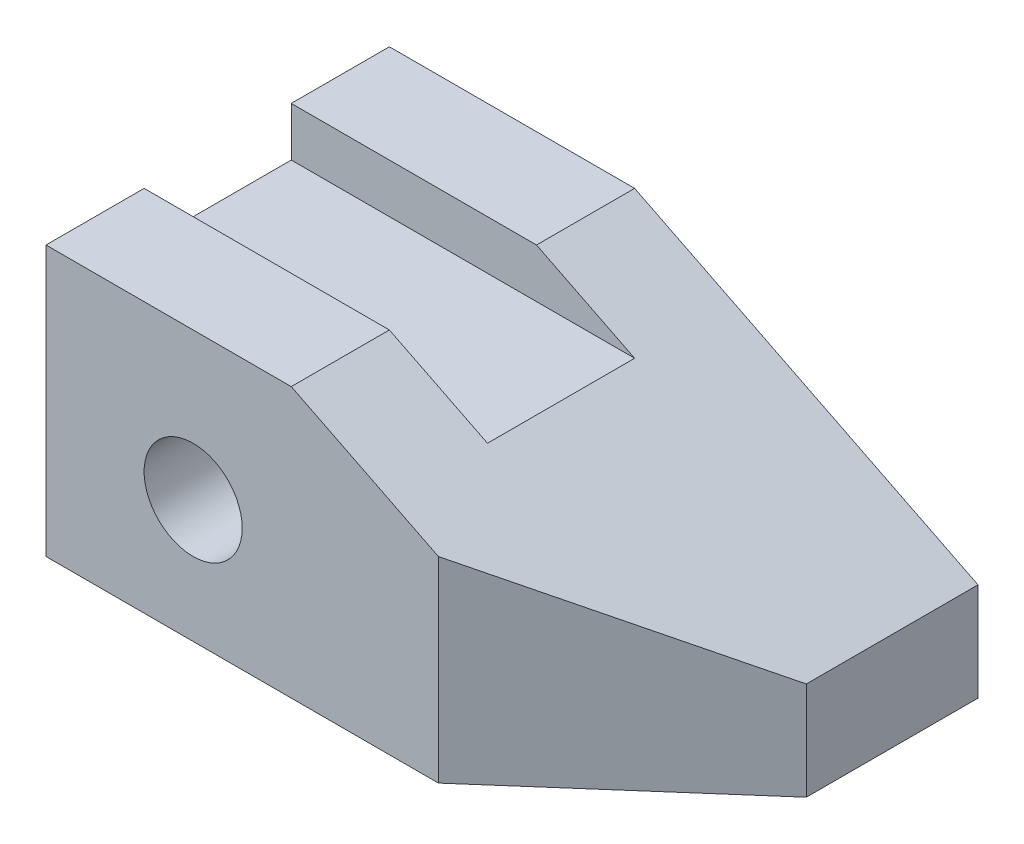
ISO-10303-21;
HEADER;
FILE_DESCRIPTION(('STEP AP214'),'2;1');
FILE_NAME('part.step','',(''),(''),'','','');
FILE_SCHEMA(('AUTOMOTIVE_DESIGN { 1 0 10303 214 1 1 1 1 }'));
ENDSEC;
DATA;
#1=APPLICATION_CONTEXT('core data for automotive mechanical design processes');
#2=APPLICATION_PROTOCOL_DEFINITION('international standard','automotive_design',2000,#1);
#3=PRODUCT_CONTEXT('',#1,'mechanical');
#4=PRODUCT('Part','Part','',(#3));
#5=PRODUCT_RELATED_PRODUCT_CATEGORY('part','',(#4));
#6=PRODUCT_DEFINITION_FORMATION('','',#4);
#7=PRODUCT_DEFINITION_CONTEXT('part definition',#1,'design');
#8=PRODUCT_DEFINITION('design','',#6,#7);
#9=PRODUCT_DEFINITION_SHAPE('','',#8);
#10=(LENGTH_UNIT() NAMED_UNIT(*) SI_UNIT(.MILLI.,.METRE.));
#11=(NAMED_UNIT(*) PLANE_ANGLE_UNIT() SI_UNIT($,.RADIAN.));
#12=(NAMED_UNIT(*) SI_UNIT($,.STERADIAN.) SOLID_ANGLE_UNIT());
#13=UNCERTAINTY_MEASURE_WITH_UNIT(LENGTH_MEASURE(1.E-05),#10,'distance_accuracy_value','');
#14=(GEOMETRIC_REPRESENTATION_CONTEXT(3) GLOBAL_UNCERTAINTY_ASSIGNED_CONTEXT((#13)) GLOBAL_UNIT_ASSIGNED_CONTEXT((#10,
#11,#12)) REPRESENTATION_CONTEXT('',''));
#15=CARTESIAN_POINT('',(0.,0.,0.));
#16=DIRECTION('',(0.,0.,1.));
#17=DIRECTION('',(1.,0.,0.));
#18=AXIS2_PLACEMENT_3D('',#15,#16,#17);
#19=CARTESIAN_POINT('',(0.,69.85,0.));
#20=DIRECTION('',(0.,-1.,0.));
#21=DIRECTION('',(0.,0.,-1.));
#22=AXIS2_PLACEMENT_3D('',#19,#20,#21);
#23=PLANE('',#22);
#24=DIRECTION('',(0.,0.,1.));
#25=VECTOR('',#24,1.);
#26=CARTESIAN_POINT('',(0.,69.85,0.));
#27=LINE('',#26,#25);
#28=CARTESIAN_POINT('',(0.,69.85,-88.9));
#29=VERTEX_POINT('',#28);
#30=CARTESIAN_POINT('',(0.,69.85,-63.5));
#31=VERTEX_POINT('',#30);
#32=EDGE_CURVE('E164',#29,#31,#27,.T.);
#33=ORIENTED_EDGE('',*,*,#32,.T.);
#34=DIRECTION('',(-1.,0.,0.));
#35=VECTOR('',#34,1.);
#36=CARTESIAN_POINT('',(152.4,69.85,-63.5));
#37=LINE('',#36,#35);
#38=CARTESIAN_POINT('',(63.5,69.85,-63.5));
#39=VERTEX_POINT('',#38);
#40=EDGE_CURVE('E123',#39,#31,#37,.T.);
#41=ORIENTED_EDGE('',*,*,#40,.F.);
#42=DIRECTION('',(0.,0.,1.));
#43=VECTOR('',#42,1.);
#44=CARTESIAN_POINT('',(63.5,69.85,-88.9));
#45=LINE('',#44,#43);
#46=CARTESIAN_POINT('',(63.4999999999999,69.85,-88.9));
#47=VERTEX_POINT('',#46);
#48=EDGE_CURVE('E157',#47,#39,#45,.T.);
#49=ORIENTED_EDGE('',*,*,#48,.F.);
#50=DIRECTION('',(-1.,0.,0.));
#51=VECTOR('',#50,1.);
#52=CARTESIAN_POINT('',(0.,69.85,-88.9));
#53=LINE('',#52,#51);
#54=EDGE_CURVE('E170',#47,#29,#53,.T.);
#55=ORIENTED_EDGE('',*,*,#54,.T.);
#56=EDGE_LOOP('',(#33,#41,#49,#55));
#57=FACE_BOUND('',#56,.T.);
#58=ADVANCED_FACE('F33',(#57),#23,.F.);
#59=CARTESIAN_POINT('',(0.,69.85,0.));
#60=DIRECTION('',(1.,0.,0.));
#61=DIRECTION('',(0.,0.,-1.));
#62=AXIS2_PLACEMENT_3D('',#59,#60,#61);
#63=PLANE('',#62);
#64=DIRECTION('',(0.,0.,1.));
#65=VECTOR('',#64,1.);
#66=CARTESIAN_POINT('',(0.,57.15,-63.5));
#67=LINE('',#66,#65);
#68=CARTESIAN_POINT('',(0.,57.15,-63.5));
#69=VERTEX_POINT('',#68);
#70=CARTESIAN_POINT('',(0.,57.15,-25.4));
#71=VERTEX_POINT('',#70);
#72=EDGE_CURVE('E112',#69,#71,#67,.T.);
#73=ORIENTED_EDGE('',*,*,#72,.F.);
#74=DIRECTION('',(0.,-1.,0.));
#75=VECTOR('',#74,1.);
#76=CARTESIAN_POINT('',(0.,69.85,-63.5));
#77=LINE('',#76,#75);
#78=EDGE_CURVE('E120',#31,#69,#77,.T.);
#79=ORIENTED_EDGE('',*,*,#78,.F.);
#80=ORIENTED_EDGE('',*,*,#32,.F.);
#81=DIRECTION('',(0.,-1.,0.));
#82=VECTOR('',#81,1.);
#83=CARTESIAN_POINT('',(0.,69.85,-88.9));
#84=LINE('',#83,#82);
#85=CARTESIAN_POINT('',(0.,0.,-88.9));
#86=VERTEX_POINT('',#85);
#87=EDGE_CURVE('E172',#29,#86,#84,.T.);
#88=ORIENTED_EDGE('',*,*,#87,.T.);
#89=DIRECTION('',(0.,0.,1.));
#90=VECTOR('',#89,1.);
#91=CARTESIAN_POINT('',(0.,0.,0.));
#92=LINE('',#91,#90);
#93=CARTESIAN_POINT('',(0.,0.,0.));
#94=VERTEX_POINT('',#93);
#95=EDGE_CURVE('E156',#86,#94,#92,.T.);
#96=ORIENTED_EDGE('',*,*,#95,.T.);
#97=DIRECTION('',(0.,-1.,0.));
#98=VECTOR('',#97,1.);
#99=CARTESIAN_POINT('',(0.,69.85,0.));
#100=LINE('',#99,#98);
#101=CARTESIAN_POINT('',(0.,69.85,0.));
#102=VERTEX_POINT('',#101);
#103=EDGE_CURVE('E187',#102,#94,#100,.T.);
#104=ORIENTED_EDGE('',*,*,#103,.F.);
#105=CARTESIAN_POINT('',(0.,69.85,-25.4));
#106=VERTEX_POINT('',#105);
#107=EDGE_CURVE('E167',#106,#102,#27,.T.);
#108=ORIENTED_EDGE('',*,*,#107,.F.);
#109=DIRECTION('',(0.,1.,0.));
#110=VECTOR('',#109,1.);
#111=CARTESIAN_POINT('',(0.,69.85,-25.4));
#112=LINE('',#111,#110);
#113=EDGE_CURVE('E117',#71,#106,#112,.T.);
#114=ORIENTED_EDGE('',*,*,#113,.F.);
#115=EDGE_LOOP('',(#73,#79,#80,#88,#96,#104,#108,#114));
#116=FACE_BOUND('',#115,.T.);
#117=ADVANCED_FACE('F35',(#116),#63,.F.);
#118=CARTESIAN_POINT('',(0.,69.85,0.));
#119=DIRECTION('',(0.,0.,-1.));
#120=DIRECTION('',(-1.,0.,0.));
#121=AXIS2_PLACEMENT_3D('',#118,#119,#120);
#122=PLANE('',#121);
#123=CARTESIAN_POINT('',(38.1,31.75,0.));
#124=DIRECTION('',(0.,0.,1.));
#125=DIRECTION('',(1.,0.,0.));
#126=AXIS2_PLACEMENT_3D('',#123,#124,#125);
#127=CIRCLE('',#126,12.7);
#128=CARTESIAN_POINT('',(50.8,31.75,0.));
#129=VERTEX_POINT('',#128);
#130=EDGE_CURVE('E143',#129,#129,#127,.T.);
#131=ORIENTED_EDGE('',*,*,#130,.F.);
#132=EDGE_LOOP('',(#131));
#133=FACE_BOUND('',#132,.T.);
#134=DIRECTION('',(1.,0.,0.));
#135=VECTOR('',#134,1.);
#136=CARTESIAN_POINT('',(0.,0.,0.));
#137=LINE('',#136,#135);
#138=CARTESIAN_POINT('',(101.6,0.,0.));
#139=VERTEX_POINT('',#138);
#140=EDGE_CURVE('E175',#94,#139,#137,.T.);
#141=ORIENTED_EDGE('',*,*,#140,.T.);
#142=DIRECTION('',(0.,1.,0.));
#143=VECTOR('',#142,1.);
#144=CARTESIAN_POINT('',(101.6,0.,0.));
#145=LINE('',#144,#143);
#146=CARTESIAN_POINT('',(101.6,50.8,0.));
#147=VERTEX_POINT('',#146);
#148=EDGE_CURVE('E140',#139,#147,#145,.T.);
#149=ORIENTED_EDGE('',*,*,#148,.T.);
#150=DIRECTION('',(0.894427190999916,-0.447213595499958,0.));
#151=VECTOR('',#150,1.);
#152=CARTESIAN_POINT('',(40.64,81.28,0.));
#153=LINE('',#152,#151);
#154=CARTESIAN_POINT('',(63.5,69.85,0.));
#155=VERTEX_POINT('',#154);
#156=EDGE_CURVE('E149',#155,#147,#153,.T.);
#157=ORIENTED_EDGE('',*,*,#156,.F.);
#158=DIRECTION('',(1.,0.,0.));
#159=VECTOR('',#158,1.);
#160=CARTESIAN_POINT('',(0.,69.85,0.));
#161=LINE('',#160,#159);
#162=EDGE_CURVE('E166',#102,#155,#161,.T.);
#163=ORIENTED_EDGE('',*,*,#162,.F.);
#164=ORIENTED_EDGE('',*,*,#103,.T.);
#165=EDGE_LOOP('',(#141,#149,#157,#163,#164));
#166=FACE_BOUND('',#165,.T.);
#167=ADVANCED_FACE('F203',(#133,#166),#122,.F.);
#168=CARTESIAN_POINT('',(152.4,69.85,0.));
#169=DIRECTION('',(-1.,0.,0.));
#170=DIRECTION('',(0.,0.,1.));
#171=AXIS2_PLACEMENT_3D('',#168,#169,#170);
#172=PLANE('',#171);
#173=DIRECTION('',(0.,0.,1.));
#174=VECTOR('',#173,1.);
#175=CARTESIAN_POINT('',(152.4,25.4,-88.9));
#176=LINE('',#175,#174);
#177=CARTESIAN_POINT('',(152.4,25.4,-88.9));
#178=VERTEX_POINT('',#177);
#179=CARTESIAN_POINT('',(152.4,25.4,-44.45));
#180=VERTEX_POINT('',#179);
#181=EDGE_CURVE('E153',#178,#180,#176,.T.);
#182=ORIENTED_EDGE('',*,*,#181,.T.);
#183=DIRECTION('',(0.,1.,0.));
#184=VECTOR('',#183,1.);
#185=CARTESIAN_POINT('',(152.4,0.,-44.45));
#186=LINE('',#185,#184);
#187=CARTESIAN_POINT('',(152.4,0.,-44.45));
#188=VERTEX_POINT('',#187);
#189=EDGE_CURVE('E56',#188,#180,#186,.T.);
#190=ORIENTED_EDGE('',*,*,#189,.F.);
#191=DIRECTION('',(0.,0.,-1.));
#192=VECTOR('',#191,1.);
#193=CARTESIAN_POINT('',(152.4,0.,0.));
#194=LINE('',#193,#192);
#195=CARTESIAN_POINT('',(152.4,0.,-88.9));
#196=VERTEX_POINT('',#195);
#197=EDGE_CURVE('E178',#188,#196,#194,.T.);
#198=ORIENTED_EDGE('',*,*,#197,.T.);
#199=DIRECTION('',(0.,-1.,0.));
#200=VECTOR('',#199,1.);
#201=CARTESIAN_POINT('',(152.4,69.85,-88.9));
#202=LINE('',#201,#200);
#203=EDGE_CURVE('E184',#178,#196,#202,.T.);
#204=ORIENTED_EDGE('',*,*,#203,.F.);
#205=EDGE_LOOP('',(#182,#190,#198,#204));
#206=FACE_BOUND('',#205,.T.);
#207=ADVANCED_FACE('F212',(#206),#172,.F.);
#208=CARTESIAN_POINT('',(0.,69.85,-88.9));
#209=DIRECTION('',(0.,0.,1.));
#210=DIRECTION('',(1.,0.,0.));
#211=AXIS2_PLACEMENT_3D('',#208,#209,#210);
#212=PLANE('',#211);
#213=CARTESIAN_POINT('',(38.1,31.75,-88.9));
#214=DIRECTION('',(0.,0.,1.));
#215=DIRECTION('',(1.,0.,0.));
#216=AXIS2_PLACEMENT_3D('',#213,#214,#215);
#217=CIRCLE('',#216,12.7);
#218=CARTESIAN_POINT('',(50.8,31.75,-88.9));
#219=VERTEX_POINT('',#218);
#220=EDGE_CURVE('E152',#219,#219,#217,.T.);
#221=ORIENTED_EDGE('',*,*,#220,.T.);
#222=EDGE_LOOP('',(#221));
#223=FACE_BOUND('',#222,.T.);
#224=ORIENTED_EDGE('',*,*,#54,.F.);
#225=DIRECTION('',(0.894427190999916,-0.447213595499958,0.));
#226=VECTOR('',#225,1.);
#227=CARTESIAN_POINT('',(40.64,81.28,-88.9));
#228=LINE('',#227,#226);
#229=EDGE_CURVE('E145',#47,#178,#228,.T.);
#230=ORIENTED_EDGE('',*,*,#229,.T.);
#231=ORIENTED_EDGE('',*,*,#203,.T.);
#232=DIRECTION('',(-1.,0.,0.));
#233=VECTOR('',#232,1.);
#234=CARTESIAN_POINT('',(0.,0.,-88.9));
#235=LINE('',#234,#233);
#236=EDGE_CURVE('E180',#196,#86,#235,.T.);
#237=ORIENTED_EDGE('',*,*,#236,.T.);
#238=ORIENTED_EDGE('',*,*,#87,.F.);
#239=EDGE_LOOP('',(#224,#230,#231,#237,#238));
#240=FACE_BOUND('',#239,.T.);
#241=ADVANCED_FACE('F215',(#223,#240),#212,.F.);
#242=CARTESIAN_POINT('',(63.5000000000002,69.85,-25.4));
#243=VERTEX_POINT('',#242);
#244=EDGE_CURVE('E148',#243,#155,#45,.T.);
#245=ORIENTED_EDGE('',*,*,#244,.F.);
#246=DIRECTION('',(-1.,0.,0.));
#247=VECTOR('',#246,1.);
#248=CARTESIAN_POINT('',(152.4,69.85,-25.4));
#249=LINE('',#248,#247);
#250=EDGE_CURVE('E134',#243,#106,#249,.T.);
#251=ORIENTED_EDGE('',*,*,#250,.T.);
#252=ORIENTED_EDGE('',*,*,#107,.T.);
#253=ORIENTED_EDGE('',*,*,#162,.T.);
#254=EDGE_LOOP('',(#245,#251,#252,#253));
#255=FACE_BOUND('',#254,.T.);
#256=ADVANCED_FACE('F199',(#255),#23,.F.);
#257=CARTESIAN_POINT('',(0.,0.,0.));
#258=DIRECTION('',(0.,-1.,0.));
#259=DIRECTION('',(0.,0.,-1.));
#260=AXIS2_PLACEMENT_3D('',#257,#258,#259);
#261=PLANE('',#260);
#262=DIRECTION('',(-0.752576694706878,0.,0.658504607868518));
#263=VECTOR('',#262,1.);
#264=CARTESIAN_POINT('',(101.6,0.,0.));
#265=LINE('',#264,#263);
#266=EDGE_CURVE('E133',#188,#139,#265,.T.);
#267=ORIENTED_EDGE('',*,*,#266,.T.);
#268=ORIENTED_EDGE('',*,*,#140,.F.);
#269=ORIENTED_EDGE('',*,*,#95,.F.);
#270=ORIENTED_EDGE('',*,*,#236,.F.);
#271=ORIENTED_EDGE('',*,*,#197,.F.);
#272=EDGE_LOOP('',(#267,#268,#269,#270,#271));
#273=FACE_BOUND('',#272,.T.);
#274=ADVANCED_FACE('F208',(#273),#261,.T.);
#275=CARTESIAN_POINT('',(40.64,81.28,-88.9));
#276=DIRECTION('',(-0.447213595499958,-0.894427190999916,0.));
#277=DIRECTION('',(0.894427190999916,-0.447213595499958,0.));
#278=AXIS2_PLACEMENT_3D('',#275,#276,#277);
#279=PLANE('',#278);
#280=ORIENTED_EDGE('',*,*,#48,.T.);
#281=DIRECTION('',(0.894427190999916,-0.447213595499958,0.));
#282=VECTOR('',#281,1.);
#283=CARTESIAN_POINT('',(40.64,81.28,-63.5));
#284=LINE('',#283,#282);
#285=CARTESIAN_POINT('',(88.9000000000001,57.15,-63.5));
#286=VERTEX_POINT('',#285);
#287=EDGE_CURVE('E11',#39,#286,#284,.T.);
#288=ORIENTED_EDGE('',*,*,#287,.T.);
#289=DIRECTION('',(0.,0.,1.));
#290=VECTOR('',#289,1.);
#291=CARTESIAN_POINT('',(88.9,57.15,-88.9));
#292=LINE('',#291,#290);
#293=CARTESIAN_POINT('',(88.9000000000001,57.15,-25.4));
#294=VERTEX_POINT('',#293);
#295=EDGE_CURVE('E115',#286,#294,#292,.T.);
#296=ORIENTED_EDGE('',*,*,#295,.T.);
#297=DIRECTION('',(-0.894427190999916,0.447213595499958,0.));
#298=VECTOR('',#297,1.);
#299=CARTESIAN_POINT('',(40.64,81.28,-25.4));
#300=LINE('',#299,#298);
#301=EDGE_CURVE('E41',#294,#243,#300,.T.);
#302=ORIENTED_EDGE('',*,*,#301,.T.);
#303=ORIENTED_EDGE('',*,*,#244,.T.);
#304=ORIENTED_EDGE('',*,*,#156,.T.);
#305=DIRECTION('',(0.704360725060499,-0.35218036253025,-0.616315634427936));
#306=VECTOR('',#305,1.);
#307=CARTESIAN_POINT('',(102.387596899225,50.4062015503876,-0.689147286821679));
#308=LINE('',#307,#306);
#309=EDGE_CURVE('E190',#147,#180,#308,.T.);
#310=ORIENTED_EDGE('',*,*,#309,.T.);
#311=ORIENTED_EDGE('',*,*,#181,.F.);
#312=ORIENTED_EDGE('',*,*,#229,.F.);
#313=EDGE_LOOP('',(#280,#288,#296,#302,#303,#304,#310,#311,#312));
#314=FACE_BOUND('',#313,.T.);
#315=ADVANCED_FACE('F195',(#314),#279,.F.);
#316=CARTESIAN_POINT('',(38.1,31.75,-88.9));
#317=DIRECTION('',(0.,0.,1.));
#318=DIRECTION('',(1.,0.,0.));
#319=AXIS2_PLACEMENT_3D('',#316,#317,#318);
#320=CYLINDRICAL_SURFACE('',#319,12.7);
#321=ORIENTED_EDGE('',*,*,#220,.F.);
#322=EDGE_LOOP('',(#321));
#323=FACE_BOUND('',#322,.T.);
#324=ORIENTED_EDGE('',*,*,#130,.T.);
#325=EDGE_LOOP('',(#324));
#326=FACE_BOUND('',#325,.T.);
#327=ADVANCED_FACE('F242',(#323,#326),#320,.F.);
#328=CARTESIAN_POINT('',(101.6,0.,0.));
#329=DIRECTION('',(-0.658504607868518,0.,-0.752576694706878));
#330=DIRECTION('',(-0.752576694706878,0.,0.658504607868518));
#331=AXIS2_PLACEMENT_3D('',#328,#329,#330);
#332=PLANE('',#331);
#333=ORIENTED_EDGE('',*,*,#148,.F.);
#334=ORIENTED_EDGE('',*,*,#266,.F.);
#335=ORIENTED_EDGE('',*,*,#189,.T.);
#336=ORIENTED_EDGE('',*,*,#309,.F.);
#337=EDGE_LOOP('',(#333,#334,#335,#336));
#338=FACE_BOUND('',#337,.T.);
#339=ADVANCED_FACE('F244',(#338),#332,.F.);
#340=CARTESIAN_POINT('',(152.4,69.85,-63.5));
#341=DIRECTION('',(0.,0.,-1.));
#342=DIRECTION('',(-1.,0.,0.));
#343=AXIS2_PLACEMENT_3D('',#340,#341,#342);
#344=PLANE('',#343);
#345=ORIENTED_EDGE('',*,*,#40,.T.);
#346=ORIENTED_EDGE('',*,*,#78,.T.);
#347=DIRECTION('',(-1.,0.,0.));
#348=VECTOR('',#347,1.);
#349=CARTESIAN_POINT('',(152.4,57.15,-63.5));
#350=LINE('',#349,#348);
#351=EDGE_CURVE('E108',#286,#69,#350,.T.);
#352=ORIENTED_EDGE('',*,*,#351,.F.);
#353=ORIENTED_EDGE('',*,*,#287,.F.);
#354=EDGE_LOOP('',(#345,#346,#352,#353));
#355=FACE_BOUND('',#354,.T.);
#356=ADVANCED_FACE('F121',(#355),#344,.F.);
#357=CARTESIAN_POINT('',(152.4,69.85,-25.4));
#358=DIRECTION('',(0.,0.,1.));
#359=DIRECTION('',(0.,-1.,0.));
#360=AXIS2_PLACEMENT_3D('',#357,#358,#359);
#361=PLANE('',#360);
#362=DIRECTION('',(-1.,0.,0.));
#363=VECTOR('',#362,1.);
#364=CARTESIAN_POINT('',(152.4,57.15,-25.4));
#365=LINE('',#364,#363);
#366=EDGE_CURVE('E48',#294,#71,#365,.T.);
#367=ORIENTED_EDGE('',*,*,#366,.T.);
#368=ORIENTED_EDGE('',*,*,#113,.T.);
#369=ORIENTED_EDGE('',*,*,#250,.F.);
#370=ORIENTED_EDGE('',*,*,#301,.F.);
#371=EDGE_LOOP('',(#367,#368,#369,#370));
#372=FACE_BOUND('',#371,.T.);
#373=ADVANCED_FACE('F256',(#372),#361,.F.);
#374=CARTESIAN_POINT('',(152.4,57.15,-63.5));
#375=DIRECTION('',(0.,-1.,0.));
#376=DIRECTION('',(0.,0.,-1.));
#377=AXIS2_PLACEMENT_3D('',#374,#375,#376);
#378=PLANE('',#377);
#379=ORIENTED_EDGE('',*,*,#351,.T.);
#380=ORIENTED_EDGE('',*,*,#72,.T.);
#381=ORIENTED_EDGE('',*,*,#366,.F.);
#382=ORIENTED_EDGE('',*,*,#295,.F.);
#383=EDGE_LOOP('',(#379,#380,#381,#382));
#384=FACE_BOUND('',#383,.T.);
#385=ADVANCED_FACE('F110',(#384),#378,.F.);
#386=CLOSED_SHELL('',(#58,#117,#167,#207,#241,#256,#274,#315,#327,#339,#356,#373,#385));
#387=MANIFOLD_SOLID_BREP('B2',#386);
#388=ADVANCED_BREP_SHAPE_REPRESENTATION('',(#18,#387),#14);
#389=SHAPE_DEFINITION_REPRESENTATION(#9,#388);
ENDSEC;
END-ISO-10303-21;
